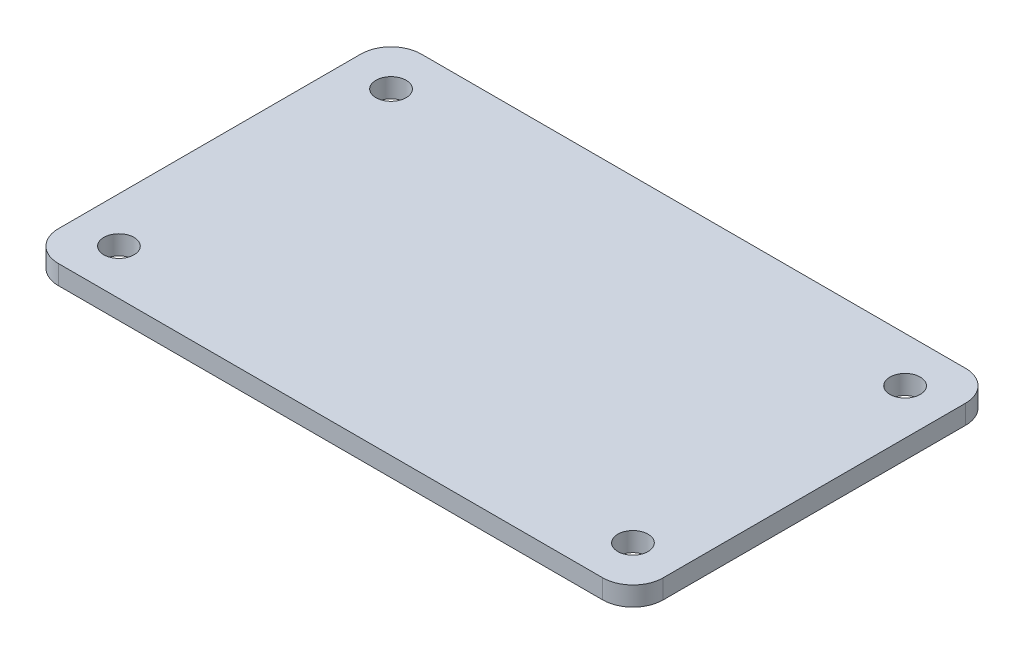
ISO-10303-21;
HEADER;
FILE_DESCRIPTION(('STEP AP214'),'2;1');
FILE_NAME('part.step','',(''),(''),'','','');
FILE_SCHEMA(('AUTOMOTIVE_DESIGN { 1 0 10303 214 1 1 1 1 }'));
ENDSEC;
DATA;
#1=APPLICATION_CONTEXT('core data for automotive mechanical design processes');
#2=APPLICATION_PROTOCOL_DEFINITION('international standard','automotive_design',2000,#1);
#3=PRODUCT_CONTEXT('',#1,'mechanical');
#4=PRODUCT('Part','Part','',(#3));
#5=PRODUCT_RELATED_PRODUCT_CATEGORY('part','',(#4));
#6=PRODUCT_DEFINITION_FORMATION('','',#4);
#7=PRODUCT_DEFINITION_CONTEXT('part definition',#1,'design');
#8=PRODUCT_DEFINITION('design','',#6,#7);
#9=PRODUCT_DEFINITION_SHAPE('','',#8);
#10=(LENGTH_UNIT() NAMED_UNIT(*) SI_UNIT(.MILLI.,.METRE.));
#11=(NAMED_UNIT(*) PLANE_ANGLE_UNIT() SI_UNIT($,.RADIAN.));
#12=(NAMED_UNIT(*) SI_UNIT($,.STERADIAN.) SOLID_ANGLE_UNIT());
#13=UNCERTAINTY_MEASURE_WITH_UNIT(LENGTH_MEASURE(1.E-05),#10,'distance_accuracy_value','');
#14=(GEOMETRIC_REPRESENTATION_CONTEXT(3) GLOBAL_UNCERTAINTY_ASSIGNED_CONTEXT((#13)) GLOBAL_UNIT_ASSIGNED_CONTEXT((#10,
#11,#12)) REPRESENTATION_CONTEXT('',''));
#15=CARTESIAN_POINT('',(0.,0.,0.));
#16=DIRECTION('',(0.,0.,1.));
#17=DIRECTION('',(1.,0.,0.));
#18=AXIS2_PLACEMENT_3D('',#15,#16,#17);
#19=CARTESIAN_POINT('',(100.,6.35,60.));
#20=DIRECTION('',(-1.,0.,0.));
#21=DIRECTION('',(0.,0.,1.));
#22=AXIS2_PLACEMENT_3D('',#19,#20,#21);
#23=PLANE('',#22);
#24=DIRECTION('',(0.,0.,-1.));
#25=VECTOR('',#24,1.);
#26=CARTESIAN_POINT('',(100.,6.35,60.));
#27=LINE('',#26,#25);
#28=CARTESIAN_POINT('',(100.,6.35,50.));
#29=VERTEX_POINT('',#28);
#30=CARTESIAN_POINT('',(100.,6.35,-50.));
#31=VERTEX_POINT('',#30);
#32=EDGE_CURVE('E128',#29,#31,#27,.T.);
#33=ORIENTED_EDGE('',*,*,#32,.F.);
#34=DIRECTION('',(0.,-1.,0.));
#35=VECTOR('',#34,1.);
#36=CARTESIAN_POINT('',(100.,6.35,50.));
#37=LINE('',#36,#35);
#38=CARTESIAN_POINT('',(100.,0.,50.));
#39=VERTEX_POINT('',#38);
#40=EDGE_CURVE('E11',#29,#39,#37,.T.);
#41=ORIENTED_EDGE('',*,*,#40,.T.);
#42=DIRECTION('',(0.,0.,-1.));
#43=VECTOR('',#42,1.);
#44=CARTESIAN_POINT('',(100.,0.,60.));
#45=LINE('',#44,#43);
#46=CARTESIAN_POINT('',(100.,0.,-50.));
#47=VERTEX_POINT('',#46);
#48=EDGE_CURVE('E130',#39,#47,#45,.T.);
#49=ORIENTED_EDGE('',*,*,#48,.T.);
#50=DIRECTION('',(0.,-1.,0.));
#51=VECTOR('',#50,1.);
#52=CARTESIAN_POINT('',(100.,6.35,-50.));
#53=LINE('',#52,#51);
#54=EDGE_CURVE('E41',#47,#31,#53,.F.);
#55=ORIENTED_EDGE('',*,*,#54,.T.);
#56=EDGE_LOOP('',(#33,#41,#49,#55));
#57=FACE_BOUND('',#56,.T.);
#58=ADVANCED_FACE('F33',(#57),#23,.F.);
#59=CARTESIAN_POINT('',(-100.,6.35,-60.));
#60=DIRECTION('',(0.,0.,1.));
#61=DIRECTION('',(1.,0.,0.));
#62=AXIS2_PLACEMENT_3D('',#59,#60,#61);
#63=PLANE('',#62);
#64=DIRECTION('',(-1.,0.,0.));
#65=VECTOR('',#64,1.);
#66=CARTESIAN_POINT('',(-100.,0.,-60.));
#67=LINE('',#66,#65);
#68=CARTESIAN_POINT('',(90.,0.,-60.));
#69=VERTEX_POINT('',#68);
#70=CARTESIAN_POINT('',(-90.,0.,-60.));
#71=VERTEX_POINT('',#70);
#72=EDGE_CURVE('E126',#69,#71,#67,.T.);
#73=ORIENTED_EDGE('',*,*,#72,.T.);
#74=DIRECTION('',(0.,-1.,0.));
#75=VECTOR('',#74,1.);
#76=CARTESIAN_POINT('',(-90.,6.35,-60.));
#77=LINE('',#76,#75);
#78=CARTESIAN_POINT('',(-90.,6.35,-60.));
#79=VERTEX_POINT('',#78);
#80=EDGE_CURVE('E105',#71,#79,#77,.F.);
#81=ORIENTED_EDGE('',*,*,#80,.T.);
#82=DIRECTION('',(-1.,0.,0.));
#83=VECTOR('',#82,1.);
#84=CARTESIAN_POINT('',(-100.,6.35,-60.));
#85=LINE('',#84,#83);
#86=CARTESIAN_POINT('',(90.,6.35,-60.));
#87=VERTEX_POINT('',#86);
#88=EDGE_CURVE('E166',#87,#79,#85,.T.);
#89=ORIENTED_EDGE('',*,*,#88,.F.);
#90=DIRECTION('',(0.,-1.,0.));
#91=VECTOR('',#90,1.);
#92=CARTESIAN_POINT('',(90.,6.35,-60.));
#93=LINE('',#92,#91);
#94=EDGE_CURVE('E110',#87,#69,#93,.T.);
#95=ORIENTED_EDGE('',*,*,#94,.T.);
#96=EDGE_LOOP('',(#73,#81,#89,#95));
#97=FACE_BOUND('',#96,.T.);
#98=ADVANCED_FACE('F170',(#97),#63,.F.);
#99=CARTESIAN_POINT('',(-100.,6.35,60.));
#100=DIRECTION('',(1.,0.,0.));
#101=DIRECTION('',(0.,0.,-1.));
#102=AXIS2_PLACEMENT_3D('',#99,#100,#101);
#103=PLANE('',#102);
#104=DIRECTION('',(0.,0.,1.));
#105=VECTOR('',#104,1.);
#106=CARTESIAN_POINT('',(-100.,6.35,60.));
#107=LINE('',#106,#105);
#108=CARTESIAN_POINT('',(-100.,6.35,-50.));
#109=VERTEX_POINT('',#108);
#110=CARTESIAN_POINT('',(-100.,6.35,50.));
#111=VERTEX_POINT('',#110);
#112=EDGE_CURVE('E119',#109,#111,#107,.T.);
#113=ORIENTED_EDGE('',*,*,#112,.F.);
#114=DIRECTION('',(0.,-1.,0.));
#115=VECTOR('',#114,1.);
#116=CARTESIAN_POINT('',(-100.,6.35,-50.));
#117=LINE('',#116,#115);
#118=CARTESIAN_POINT('',(-100.,0.,-50.));
#119=VERTEX_POINT('',#118);
#120=EDGE_CURVE('E104',#109,#119,#117,.T.);
#121=ORIENTED_EDGE('',*,*,#120,.T.);
#122=DIRECTION('',(0.,0.,1.));
#123=VECTOR('',#122,1.);
#124=CARTESIAN_POINT('',(-100.,0.,60.));
#125=LINE('',#124,#123);
#126=CARTESIAN_POINT('',(-100.,0.,50.));
#127=VERTEX_POINT('',#126);
#128=EDGE_CURVE('E117',#119,#127,#125,.T.);
#129=ORIENTED_EDGE('',*,*,#128,.T.);
#130=DIRECTION('',(0.,-1.,0.));
#131=VECTOR('',#130,1.);
#132=CARTESIAN_POINT('',(-100.,6.35,50.));
#133=LINE('',#132,#131);
#134=EDGE_CURVE('E121',#127,#111,#133,.F.);
#135=ORIENTED_EDGE('',*,*,#134,.T.);
#136=EDGE_LOOP('',(#113,#121,#129,#135));
#137=FACE_BOUND('',#136,.T.);
#138=ADVANCED_FACE('F116',(#137),#103,.F.);
#139=CARTESIAN_POINT('',(-100.,6.35,60.));
#140=DIRECTION('',(0.,0.,-1.));
#141=DIRECTION('',(-1.,0.,0.));
#142=AXIS2_PLACEMENT_3D('',#139,#140,#141);
#143=PLANE('',#142);
#144=DIRECTION('',(1.,0.,0.));
#145=VECTOR('',#144,1.);
#146=CARTESIAN_POINT('',(-100.,6.35,60.));
#147=LINE('',#146,#145);
#148=CARTESIAN_POINT('',(-90.,6.35,60.));
#149=VERTEX_POINT('',#148);
#150=CARTESIAN_POINT('',(90.,6.35,60.));
#151=VERTEX_POINT('',#150);
#152=EDGE_CURVE('E134',#149,#151,#147,.T.);
#153=ORIENTED_EDGE('',*,*,#152,.F.);
#154=DIRECTION('',(0.,-1.,0.));
#155=VECTOR('',#154,1.);
#156=CARTESIAN_POINT('',(-90.,6.35,60.));
#157=LINE('',#156,#155);
#158=CARTESIAN_POINT('',(-90.,0.,60.));
#159=VERTEX_POINT('',#158);
#160=EDGE_CURVE('E151',#149,#159,#157,.T.);
#161=ORIENTED_EDGE('',*,*,#160,.T.);
#162=DIRECTION('',(1.,0.,0.));
#163=VECTOR('',#162,1.);
#164=CARTESIAN_POINT('',(-100.,0.,60.));
#165=LINE('',#164,#163);
#166=CARTESIAN_POINT('',(90.,0.,60.));
#167=VERTEX_POINT('',#166);
#168=EDGE_CURVE('E125',#159,#167,#165,.T.);
#169=ORIENTED_EDGE('',*,*,#168,.T.);
#170=DIRECTION('',(0.,-1.,0.));
#171=VECTOR('',#170,1.);
#172=CARTESIAN_POINT('',(90.,6.35,60.));
#173=LINE('',#172,#171);
#174=EDGE_CURVE('E48',#167,#151,#173,.F.);
#175=ORIENTED_EDGE('',*,*,#174,.T.);
#176=EDGE_LOOP('',(#153,#161,#169,#175));
#177=FACE_BOUND('',#176,.T.);
#178=ADVANCED_FACE('F204',(#177),#143,.F.);
#179=CARTESIAN_POINT('',(0.,6.35,0.));
#180=DIRECTION('',(0.,-1.,0.));
#181=DIRECTION('',(0.,0.,-1.));
#182=AXIS2_PLACEMENT_3D('',#179,#180,#181);
#183=PLANE('',#182);
#184=CARTESIAN_POINT('',(-85.,6.35,-45.));
#185=DIRECTION('',(0.,1.,0.));
#186=DIRECTION('',(0.,0.,1.));
#187=AXIS2_PLACEMENT_3D('',#184,#185,#186);
#188=CIRCLE('',#187,4.99999999999998);
#189=CARTESIAN_POINT('',(-85.,6.35,-40.));
#190=VERTEX_POINT('',#189);
#191=EDGE_CURVE('E196',#190,#190,#188,.T.);
#192=ORIENTED_EDGE('',*,*,#191,.F.);
#193=EDGE_LOOP('',(#192));
#194=FACE_BOUND('',#193,.T.);
#195=CARTESIAN_POINT('',(-85.,6.35,45.));
#196=DIRECTION('',(0.,1.,0.));
#197=DIRECTION('',(0.,0.,1.));
#198=AXIS2_PLACEMENT_3D('',#195,#196,#197);
#199=CIRCLE('',#198,4.99999999999998);
#200=CARTESIAN_POINT('',(-85.,6.35,50.));
#201=VERTEX_POINT('',#200);
#202=EDGE_CURVE('E190',#201,#201,#199,.T.);
#203=ORIENTED_EDGE('',*,*,#202,.F.);
#204=EDGE_LOOP('',(#203));
#205=FACE_BOUND('',#204,.T.);
#206=CARTESIAN_POINT('',(85.,6.35,45.));
#207=DIRECTION('',(0.,1.,0.));
#208=DIRECTION('',(0.,0.,1.));
#209=AXIS2_PLACEMENT_3D('',#206,#207,#208);
#210=CIRCLE('',#209,4.99999999999998);
#211=CARTESIAN_POINT('',(85.,6.35,50.));
#212=VERTEX_POINT('',#211);
#213=EDGE_CURVE('E184',#212,#212,#210,.T.);
#214=ORIENTED_EDGE('',*,*,#213,.F.);
#215=EDGE_LOOP('',(#214));
#216=FACE_BOUND('',#215,.T.);
#217=CARTESIAN_POINT('',(85.,6.35,-45.));
#218=DIRECTION('',(0.,1.,0.));
#219=DIRECTION('',(0.,0.,1.));
#220=AXIS2_PLACEMENT_3D('',#217,#218,#219);
#221=CIRCLE('',#220,4.99999999999998);
#222=CARTESIAN_POINT('',(85.,6.35,-40.));
#223=VERTEX_POINT('',#222);
#224=EDGE_CURVE('E173',#223,#223,#221,.T.);
#225=ORIENTED_EDGE('',*,*,#224,.F.);
#226=EDGE_LOOP('',(#225));
#227=FACE_BOUND('',#226,.T.);
#228=ORIENTED_EDGE('',*,*,#88,.T.);
#229=CARTESIAN_POINT('',(-90.,6.35,-50.));
#230=DIRECTION('',(0.,-1.,0.));
#231=DIRECTION('',(0.,0.,-1.));
#232=AXIS2_PLACEMENT_3D('',#229,#230,#231);
#233=CIRCLE('',#232,10.);
#234=EDGE_CURVE('E148',#79,#109,#233,.F.);
#235=ORIENTED_EDGE('',*,*,#234,.T.);
#236=ORIENTED_EDGE('',*,*,#112,.T.);
#237=CARTESIAN_POINT('',(-90.,6.35,50.));
#238=DIRECTION('',(0.,-1.,0.));
#239=DIRECTION('',(0.,0.,-1.));
#240=AXIS2_PLACEMENT_3D('',#237,#238,#239);
#241=CIRCLE('',#240,10.);
#242=EDGE_CURVE('E55',#111,#149,#241,.F.);
#243=ORIENTED_EDGE('',*,*,#242,.T.);
#244=ORIENTED_EDGE('',*,*,#152,.T.);
#245=CARTESIAN_POINT('',(90.,6.35,50.));
#246=DIRECTION('',(0.,-1.,0.));
#247=DIRECTION('',(0.,0.,-1.));
#248=AXIS2_PLACEMENT_3D('',#245,#246,#247);
#249=CIRCLE('',#248,10.);
#250=EDGE_CURVE('E145',#151,#29,#249,.F.);
#251=ORIENTED_EDGE('',*,*,#250,.T.);
#252=ORIENTED_EDGE('',*,*,#32,.T.);
#253=CARTESIAN_POINT('',(90.,6.35,-50.));
#254=DIRECTION('',(0.,-1.,0.));
#255=DIRECTION('',(0.,0.,-1.));
#256=AXIS2_PLACEMENT_3D('',#253,#254,#255);
#257=CIRCLE('',#256,10.);
#258=EDGE_CURVE('E143',#31,#87,#257,.F.);
#259=ORIENTED_EDGE('',*,*,#258,.T.);
#260=EDGE_LOOP('',(#228,#235,#236,#243,#244,#251,#252,#259));
#261=FACE_BOUND('',#260,.T.);
#262=ADVANCED_FACE('F163',(#194,#205,#216,#227,#261),#183,.F.);
#263=CARTESIAN_POINT('',(0.,0.,0.));
#264=DIRECTION('',(0.,-1.,0.));
#265=DIRECTION('',(0.,0.,-1.));
#266=AXIS2_PLACEMENT_3D('',#263,#264,#265);
#267=PLANE('',#266);
#268=CARTESIAN_POINT('',(-85.,0.,-45.));
#269=DIRECTION('',(0.,1.,0.));
#270=DIRECTION('',(0.,0.,1.));
#271=AXIS2_PLACEMENT_3D('',#268,#269,#270);
#272=CIRCLE('',#271,4.99999999999998);
#273=CARTESIAN_POINT('',(-85.,0.,-40.));
#274=VERTEX_POINT('',#273);
#275=EDGE_CURVE('E193',#274,#274,#272,.T.);
#276=ORIENTED_EDGE('',*,*,#275,.T.);
#277=EDGE_LOOP('',(#276));
#278=FACE_BOUND('',#277,.T.);
#279=CARTESIAN_POINT('',(-85.,0.,45.));
#280=DIRECTION('',(0.,1.,0.));
#281=DIRECTION('',(0.,0.,1.));
#282=AXIS2_PLACEMENT_3D('',#279,#280,#281);
#283=CIRCLE('',#282,4.99999999999998);
#284=CARTESIAN_POINT('',(-85.,0.,50.));
#285=VERTEX_POINT('',#284);
#286=EDGE_CURVE('E187',#285,#285,#283,.T.);
#287=ORIENTED_EDGE('',*,*,#286,.T.);
#288=EDGE_LOOP('',(#287));
#289=FACE_BOUND('',#288,.T.);
#290=CARTESIAN_POINT('',(85.,0.,45.));
#291=DIRECTION('',(0.,1.,0.));
#292=DIRECTION('',(0.,0.,1.));
#293=AXIS2_PLACEMENT_3D('',#290,#291,#292);
#294=CIRCLE('',#293,4.99999999999998);
#295=CARTESIAN_POINT('',(85.,0.,50.));
#296=VERTEX_POINT('',#295);
#297=EDGE_CURVE('E181',#296,#296,#294,.T.);
#298=ORIENTED_EDGE('',*,*,#297,.T.);
#299=EDGE_LOOP('',(#298));
#300=FACE_BOUND('',#299,.T.);
#301=CARTESIAN_POINT('',(85.,0.,-45.));
#302=DIRECTION('',(0.,1.,0.));
#303=DIRECTION('',(0.,0.,1.));
#304=AXIS2_PLACEMENT_3D('',#301,#302,#303);
#305=CIRCLE('',#304,4.99999999999998);
#306=CARTESIAN_POINT('',(85.,0.,-40.));
#307=VERTEX_POINT('',#306);
#308=EDGE_CURVE('E171',#307,#307,#305,.T.);
#309=ORIENTED_EDGE('',*,*,#308,.T.);
#310=EDGE_LOOP('',(#309));
#311=FACE_BOUND('',#310,.T.);
#312=ORIENTED_EDGE('',*,*,#128,.F.);
#313=CARTESIAN_POINT('',(-90.,0.,-50.));
#314=DIRECTION('',(0.,-1.,0.));
#315=DIRECTION('',(0.,0.,-1.));
#316=AXIS2_PLACEMENT_3D('',#313,#314,#315);
#317=CIRCLE('',#316,10.);
#318=EDGE_CURVE('E100',#119,#71,#317,.T.);
#319=ORIENTED_EDGE('',*,*,#318,.T.);
#320=ORIENTED_EDGE('',*,*,#72,.F.);
#321=CARTESIAN_POINT('',(90.,0.,-50.));
#322=DIRECTION('',(0.,-1.,0.));
#323=DIRECTION('',(0.,0.,-1.));
#324=AXIS2_PLACEMENT_3D('',#321,#322,#323);
#325=CIRCLE('',#324,10.);
#326=EDGE_CURVE('E120',#69,#47,#325,.T.);
#327=ORIENTED_EDGE('',*,*,#326,.T.);
#328=ORIENTED_EDGE('',*,*,#48,.F.);
#329=CARTESIAN_POINT('',(90.,0.,50.));
#330=DIRECTION('',(0.,-1.,0.));
#331=DIRECTION('',(0.,0.,-1.));
#332=AXIS2_PLACEMENT_3D('',#329,#330,#331);
#333=CIRCLE('',#332,10.);
#334=EDGE_CURVE('E137',#39,#167,#333,.T.);
#335=ORIENTED_EDGE('',*,*,#334,.T.);
#336=ORIENTED_EDGE('',*,*,#168,.F.);
#337=CARTESIAN_POINT('',(-90.,0.,50.));
#338=DIRECTION('',(0.,-1.,0.));
#339=DIRECTION('',(0.,0.,-1.));
#340=AXIS2_PLACEMENT_3D('',#337,#338,#339);
#341=CIRCLE('',#340,10.);
#342=EDGE_CURVE('E111',#159,#127,#341,.T.);
#343=ORIENTED_EDGE('',*,*,#342,.T.);
#344=EDGE_LOOP('',(#312,#319,#320,#327,#328,#335,#336,#343));
#345=FACE_BOUND('',#344,.T.);
#346=ADVANCED_FACE('F123',(#278,#289,#300,#311,#345),#267,.T.);
#347=CARTESIAN_POINT('',(85.,6.35,-45.));
#348=DIRECTION('',(0.,1.,0.));
#349=DIRECTION('',(0.,0.,1.));
#350=AXIS2_PLACEMENT_3D('',#347,#348,#349);
#351=CYLINDRICAL_SURFACE('',#350,4.99999999999998);
#352=ORIENTED_EDGE('',*,*,#308,.F.);
#353=EDGE_LOOP('',(#352));
#354=FACE_BOUND('',#353,.T.);
#355=ORIENTED_EDGE('',*,*,#224,.T.);
#356=EDGE_LOOP('',(#355));
#357=FACE_BOUND('',#356,.T.);
#358=ADVANCED_FACE('F212',(#354,#357),#351,.F.);
#359=CARTESIAN_POINT('',(85.,6.35,45.));
#360=DIRECTION('',(0.,1.,0.));
#361=DIRECTION('',(0.,0.,1.));
#362=AXIS2_PLACEMENT_3D('',#359,#360,#361);
#363=CYLINDRICAL_SURFACE('',#362,4.99999999999998);
#364=ORIENTED_EDGE('',*,*,#297,.F.);
#365=EDGE_LOOP('',(#364));
#366=FACE_BOUND('',#365,.T.);
#367=ORIENTED_EDGE('',*,*,#213,.T.);
#368=EDGE_LOOP('',(#367));
#369=FACE_BOUND('',#368,.T.);
#370=ADVANCED_FACE('F214',(#366,#369),#363,.F.);
#371=CARTESIAN_POINT('',(-85.,6.35,45.));
#372=DIRECTION('',(0.,1.,0.));
#373=DIRECTION('',(0.,0.,1.));
#374=AXIS2_PLACEMENT_3D('',#371,#372,#373);
#375=CYLINDRICAL_SURFACE('',#374,4.99999999999998);
#376=ORIENTED_EDGE('',*,*,#286,.F.);
#377=EDGE_LOOP('',(#376));
#378=FACE_BOUND('',#377,.T.);
#379=ORIENTED_EDGE('',*,*,#202,.T.);
#380=EDGE_LOOP('',(#379));
#381=FACE_BOUND('',#380,.T.);
#382=ADVANCED_FACE('F221',(#378,#381),#375,.F.);
#383=CARTESIAN_POINT('',(-85.,6.35,-45.));
#384=DIRECTION('',(0.,1.,0.));
#385=DIRECTION('',(0.,0.,1.));
#386=AXIS2_PLACEMENT_3D('',#383,#384,#385);
#387=CYLINDRICAL_SURFACE('',#386,4.99999999999998);
#388=ORIENTED_EDGE('',*,*,#275,.F.);
#389=EDGE_LOOP('',(#388));
#390=FACE_BOUND('',#389,.T.);
#391=ORIENTED_EDGE('',*,*,#191,.T.);
#392=EDGE_LOOP('',(#391));
#393=FACE_BOUND('',#392,.T.);
#394=ADVANCED_FACE('F200',(#390,#393),#387,.F.);
#395=CARTESIAN_POINT('',(-90.,6.35,-50.));
#396=DIRECTION('',(0.,-1.,0.));
#397=DIRECTION('',(0.,0.,-1.));
#398=AXIS2_PLACEMENT_3D('',#395,#396,#397);
#399=CYLINDRICAL_SURFACE('',#398,10.);
#400=ORIENTED_EDGE('',*,*,#234,.F.);
#401=ORIENTED_EDGE('',*,*,#80,.F.);
#402=ORIENTED_EDGE('',*,*,#318,.F.);
#403=ORIENTED_EDGE('',*,*,#120,.F.);
#404=EDGE_LOOP('',(#400,#401,#402,#403));
#405=FACE_BOUND('',#404,.T.);
#406=ADVANCED_FACE('F103',(#405),#399,.T.);
#407=CARTESIAN_POINT('',(-90.,6.35,50.));
#408=DIRECTION('',(0.,-1.,0.));
#409=DIRECTION('',(0.,0.,-1.));
#410=AXIS2_PLACEMENT_3D('',#407,#408,#409);
#411=CYLINDRICAL_SURFACE('',#410,10.);
#412=ORIENTED_EDGE('',*,*,#242,.F.);
#413=ORIENTED_EDGE('',*,*,#134,.F.);
#414=ORIENTED_EDGE('',*,*,#342,.F.);
#415=ORIENTED_EDGE('',*,*,#160,.F.);
#416=EDGE_LOOP('',(#412,#413,#414,#415));
#417=FACE_BOUND('',#416,.T.);
#418=ADVANCED_FACE('F237',(#417),#411,.T.);
#419=CARTESIAN_POINT('',(90.,6.35,50.));
#420=DIRECTION('',(0.,-1.,0.));
#421=DIRECTION('',(0.,0.,-1.));
#422=AXIS2_PLACEMENT_3D('',#419,#420,#421);
#423=CYLINDRICAL_SURFACE('',#422,10.);
#424=ORIENTED_EDGE('',*,*,#250,.F.);
#425=ORIENTED_EDGE('',*,*,#174,.F.);
#426=ORIENTED_EDGE('',*,*,#334,.F.);
#427=ORIENTED_EDGE('',*,*,#40,.F.);
#428=EDGE_LOOP('',(#424,#425,#426,#427));
#429=FACE_BOUND('',#428,.T.);
#430=ADVANCED_FACE('F239',(#429),#423,.T.);
#431=CARTESIAN_POINT('',(90.,6.35,-50.));
#432=DIRECTION('',(0.,-1.,0.));
#433=DIRECTION('',(0.,0.,-1.));
#434=AXIS2_PLACEMENT_3D('',#431,#432,#433);
#435=CYLINDRICAL_SURFACE('',#434,10.);
#436=ORIENTED_EDGE('',*,*,#258,.F.);
#437=ORIENTED_EDGE('',*,*,#54,.F.);
#438=ORIENTED_EDGE('',*,*,#326,.F.);
#439=ORIENTED_EDGE('',*,*,#94,.F.);
#440=EDGE_LOOP('',(#436,#437,#438,#439));
#441=FACE_BOUND('',#440,.T.);
#442=ADVANCED_FACE('F35',(#441),#435,.T.);
#443=CLOSED_SHELL('',(#58,#98,#138,#178,#262,#346,#358,#370,#382,#394,#406,#418,#430,#442));
#444=MANIFOLD_SOLID_BREP('B2',#443);
#445=ADVANCED_BREP_SHAPE_REPRESENTATION('',(#18,#444),#14);
#446=SHAPE_DEFINITION_REPRESENTATION(#9,#445);
ENDSEC;
END-ISO-10303-21;
